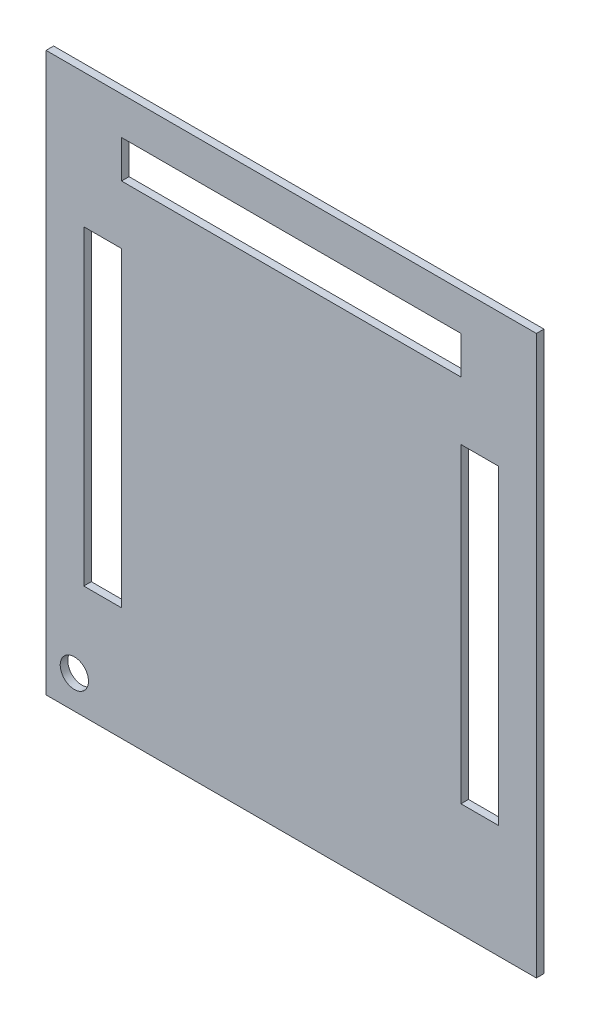
ISO-10303-21;
HEADER;
FILE_DESCRIPTION(('STEP AP214'),'2;1');
FILE_NAME('part.step','',(''),(''),'','','');
FILE_SCHEMA(('AUTOMOTIVE_DESIGN { 1 0 10303 214 1 1 1 1 }'));
ENDSEC;
DATA;
#1=APPLICATION_CONTEXT('core data for automotive mechanical design processes');
#2=APPLICATION_PROTOCOL_DEFINITION('international standard','automotive_design',2000,#1);
#3=PRODUCT_CONTEXT('',#1,'mechanical');
#4=PRODUCT('Part','Part','',(#3));
#5=PRODUCT_RELATED_PRODUCT_CATEGORY('part','',(#4));
#6=PRODUCT_DEFINITION_FORMATION('','',#4);
#7=PRODUCT_DEFINITION_CONTEXT('part definition',#1,'design');
#8=PRODUCT_DEFINITION('design','',#6,#7);
#9=PRODUCT_DEFINITION_SHAPE('','',#8);
#10=(LENGTH_UNIT() NAMED_UNIT(*) SI_UNIT(.MILLI.,.METRE.));
#11=(NAMED_UNIT(*) PLANE_ANGLE_UNIT() SI_UNIT($,.RADIAN.));
#12=(NAMED_UNIT(*) SI_UNIT($,.STERADIAN.) SOLID_ANGLE_UNIT());
#13=UNCERTAINTY_MEASURE_WITH_UNIT(LENGTH_MEASURE(1.E-05),#10,'distance_accuracy_value','');
#14=(GEOMETRIC_REPRESENTATION_CONTEXT(3) GLOBAL_UNCERTAINTY_ASSIGNED_CONTEXT((#13)) GLOBAL_UNIT_ASSIGNED_CONTEXT((#10,
#11,#12)) REPRESENTATION_CONTEXT('',''));
#15=CARTESIAN_POINT('',(0.,0.,0.));
#16=DIRECTION('',(0.,0.,1.));
#17=DIRECTION('',(1.,0.,0.));
#18=AXIS2_PLACEMENT_3D('',#15,#16,#17);
#19=CARTESIAN_POINT('',(0.,0.,4.));
#20=DIRECTION('',(1.,0.,0.));
#21=DIRECTION('',(0.,0.,-1.));
#22=AXIS2_PLACEMENT_3D('',#19,#20,#21);
#23=PLANE('',#22);
#24=DIRECTION('',(0.,-1.,0.));
#25=VECTOR('',#24,1.);
#26=CARTESIAN_POINT('',(0.,0.,0.));
#27=LINE('',#26,#25);
#28=CARTESIAN_POINT('',(0.,296.,0.));
#29=VERTEX_POINT('',#28);
#30=CARTESIAN_POINT('',(0.,0.,0.));
#31=VERTEX_POINT('',#30);
#32=EDGE_CURVE('E286',#29,#31,#27,.T.);
#33=ORIENTED_EDGE('',*,*,#32,.T.);
#34=DIRECTION('',(0.,0.,-1.));
#35=VECTOR('',#34,1.);
#36=CARTESIAN_POINT('',(0.,0.,4.));
#37=LINE('',#36,#35);
#38=CARTESIAN_POINT('',(0.,0.,4.));
#39=VERTEX_POINT('',#38);
#40=EDGE_CURVE('E11',#39,#31,#37,.T.);
#41=ORIENTED_EDGE('',*,*,#40,.F.);
#42=DIRECTION('',(0.,-1.,0.));
#43=VECTOR('',#42,1.);
#44=CARTESIAN_POINT('',(0.,0.,4.));
#45=LINE('',#44,#43);
#46=CARTESIAN_POINT('',(0.,296.,4.));
#47=VERTEX_POINT('',#46);
#48=EDGE_CURVE('E296',#47,#39,#45,.T.);
#49=ORIENTED_EDGE('',*,*,#48,.F.);
#50=DIRECTION('',(0.,0.,-1.));
#51=VECTOR('',#50,1.);
#52=CARTESIAN_POINT('',(0.,296.,4.));
#53=LINE('',#52,#51);
#54=EDGE_CURVE('E310',#47,#29,#53,.T.);
#55=ORIENTED_EDGE('',*,*,#54,.T.);
#56=EDGE_LOOP('',(#33,#41,#49,#55));
#57=FACE_BOUND('',#56,.T.);
#58=ADVANCED_FACE('F45',(#57),#23,.F.);
#59=CARTESIAN_POINT('',(0.,0.,4.));
#60=DIRECTION('',(0.,1.,0.));
#61=DIRECTION('',(0.,0.,1.));
#62=AXIS2_PLACEMENT_3D('',#59,#60,#61);
#63=PLANE('',#62);
#64=DIRECTION('',(1.,0.,0.));
#65=VECTOR('',#64,1.);
#66=CARTESIAN_POINT('',(0.,0.,0.));
#67=LINE('',#66,#65);
#68=CARTESIAN_POINT('',(260.,0.,0.));
#69=VERTEX_POINT('',#68);
#70=EDGE_CURVE('E314',#31,#69,#67,.T.);
#71=ORIENTED_EDGE('',*,*,#70,.T.);
#72=DIRECTION('',(0.,0.,-1.));
#73=VECTOR('',#72,1.);
#74=CARTESIAN_POINT('',(260.,0.,4.));
#75=LINE('',#74,#73);
#76=CARTESIAN_POINT('',(260.,0.,4.));
#77=VERTEX_POINT('',#76);
#78=EDGE_CURVE('E53',#77,#69,#75,.T.);
#79=ORIENTED_EDGE('',*,*,#78,.F.);
#80=DIRECTION('',(1.,0.,0.));
#81=VECTOR('',#80,1.);
#82=CARTESIAN_POINT('',(0.,0.,4.));
#83=LINE('',#82,#81);
#84=EDGE_CURVE('E300',#39,#77,#83,.T.);
#85=ORIENTED_EDGE('',*,*,#84,.F.);
#86=ORIENTED_EDGE('',*,*,#40,.T.);
#87=EDGE_LOOP('',(#71,#79,#85,#86));
#88=FACE_BOUND('',#87,.T.);
#89=ADVANCED_FACE('F349',(#88),#63,.F.);
#90=CARTESIAN_POINT('',(260.,0.,4.));
#91=DIRECTION('',(-1.,0.,0.));
#92=DIRECTION('',(0.,0.,1.));
#93=AXIS2_PLACEMENT_3D('',#90,#91,#92);
#94=PLANE('',#93);
#95=DIRECTION('',(0.,1.,0.));
#96=VECTOR('',#95,1.);
#97=CARTESIAN_POINT('',(260.,0.,0.));
#98=LINE('',#97,#96);
#99=CARTESIAN_POINT('',(260.,296.,0.));
#100=VERTEX_POINT('',#99);
#101=EDGE_CURVE('E317',#69,#100,#98,.T.);
#102=ORIENTED_EDGE('',*,*,#101,.T.);
#103=DIRECTION('',(0.,0.,-1.));
#104=VECTOR('',#103,1.);
#105=CARTESIAN_POINT('',(260.,296.,4.));
#106=LINE('',#105,#104);
#107=CARTESIAN_POINT('',(260.,296.,4.));
#108=VERTEX_POINT('',#107);
#109=EDGE_CURVE('E325',#108,#100,#106,.T.);
#110=ORIENTED_EDGE('',*,*,#109,.F.);
#111=DIRECTION('',(0.,1.,0.));
#112=VECTOR('',#111,1.);
#113=CARTESIAN_POINT('',(260.,0.,4.));
#114=LINE('',#113,#112);
#115=EDGE_CURVE('E304',#77,#108,#114,.T.);
#116=ORIENTED_EDGE('',*,*,#115,.F.);
#117=ORIENTED_EDGE('',*,*,#78,.T.);
#118=EDGE_LOOP('',(#102,#110,#116,#117));
#119=FACE_BOUND('',#118,.T.);
#120=ADVANCED_FACE('F334',(#119),#94,.F.);
#121=CARTESIAN_POINT('',(0.,296.,4.));
#122=DIRECTION('',(0.,-1.,0.));
#123=DIRECTION('',(0.,0.,-1.));
#124=AXIS2_PLACEMENT_3D('',#121,#122,#123);
#125=PLANE('',#124);
#126=DIRECTION('',(-1.,0.,0.));
#127=VECTOR('',#126,1.);
#128=CARTESIAN_POINT('',(0.,296.,0.));
#129=LINE('',#128,#127);
#130=EDGE_CURVE('E301',#100,#29,#129,.T.);
#131=ORIENTED_EDGE('',*,*,#130,.T.);
#132=ORIENTED_EDGE('',*,*,#54,.F.);
#133=DIRECTION('',(-1.,0.,0.));
#134=VECTOR('',#133,1.);
#135=CARTESIAN_POINT('',(0.,296.,4.));
#136=LINE('',#135,#134);
#137=EDGE_CURVE('E307',#108,#47,#136,.T.);
#138=ORIENTED_EDGE('',*,*,#137,.F.);
#139=ORIENTED_EDGE('',*,*,#109,.T.);
#140=EDGE_LOOP('',(#131,#132,#138,#139));
#141=FACE_BOUND('',#140,.T.);
#142=ADVANCED_FACE('F343',(#141),#125,.F.);
#143=CARTESIAN_POINT('',(0.,0.,4.));
#144=DIRECTION('',(0.,0.,-1.));
#145=DIRECTION('',(-1.,0.,0.));
#146=AXIS2_PLACEMENT_3D('',#143,#144,#145);
#147=PLANE('',#146);
#148=CARTESIAN_POINT('',(15.,17.5,4.));
#149=DIRECTION('',(0.,0.,1.));
#150=DIRECTION('',(1.,0.,0.));
#151=AXIS2_PLACEMENT_3D('',#148,#149,#150);
#152=CIRCLE('',#151,7.5);
#153=CARTESIAN_POINT('',(22.5,17.5,4.));
#154=VERTEX_POINT('',#153);
#155=EDGE_CURVE('E218',#154,#154,#152,.T.);
#156=ORIENTED_EDGE('',*,*,#155,.F.);
#157=EDGE_LOOP('',(#156));
#158=FACE_BOUND('',#157,.T.);
#159=DIRECTION('',(-1.,0.,0.));
#160=VECTOR('',#159,1.);
#161=CARTESIAN_POINT('',(220.,276.,4.));
#162=LINE('',#161,#160);
#163=CARTESIAN_POINT('',(220.,276.,4.));
#164=VERTEX_POINT('',#163);
#165=CARTESIAN_POINT('',(40.,276.,4.));
#166=VERTEX_POINT('',#165);
#167=EDGE_CURVE('E228',#164,#166,#162,.T.);
#168=ORIENTED_EDGE('',*,*,#167,.F.);
#169=DIRECTION('',(0.,1.,0.));
#170=VECTOR('',#169,1.);
#171=CARTESIAN_POINT('',(220.,276.,4.));
#172=LINE('',#171,#170);
#173=CARTESIAN_POINT('',(220.,256.,4.));
#174=VERTEX_POINT('',#173);
#175=EDGE_CURVE('E60',#174,#164,#172,.T.);
#176=ORIENTED_EDGE('',*,*,#175,.F.);
#177=DIRECTION('',(1.,0.,0.));
#178=VECTOR('',#177,1.);
#179=CARTESIAN_POINT('',(220.,256.,4.));
#180=LINE('',#179,#178);
#181=CARTESIAN_POINT('',(40.,256.,4.));
#182=VERTEX_POINT('',#181);
#183=EDGE_CURVE('E219',#182,#174,#180,.T.);
#184=ORIENTED_EDGE('',*,*,#183,.F.);
#185=DIRECTION('',(0.,-1.,0.));
#186=VECTOR('',#185,1.);
#187=CARTESIAN_POINT('',(40.,276.,4.));
#188=LINE('',#187,#186);
#189=EDGE_CURVE('E223',#166,#182,#188,.T.);
#190=ORIENTED_EDGE('',*,*,#189,.F.);
#191=EDGE_LOOP('',(#168,#176,#184,#190));
#192=FACE_BOUND('',#191,.T.);
#193=DIRECTION('',(1.,0.,0.));
#194=VECTOR('',#193,1.);
#195=CARTESIAN_POINT('',(20.,60.,4.));
#196=LINE('',#195,#194);
#197=CARTESIAN_POINT('',(20.,60.,4.));
#198=VERTEX_POINT('',#197);
#199=CARTESIAN_POINT('',(40.,60.,4.));
#200=VERTEX_POINT('',#199);
#201=EDGE_CURVE('E180',#198,#200,#196,.T.);
#202=ORIENTED_EDGE('',*,*,#201,.F.);
#203=DIRECTION('',(0.,-1.,0.));
#204=VECTOR('',#203,1.);
#205=CARTESIAN_POINT('',(20.,60.,4.));
#206=LINE('',#205,#204);
#207=CARTESIAN_POINT('',(20.,225.,4.));
#208=VERTEX_POINT('',#207);
#209=EDGE_CURVE('E68',#208,#198,#206,.T.);
#210=ORIENTED_EDGE('',*,*,#209,.F.);
#211=DIRECTION('',(-1.,0.,0.));
#212=VECTOR('',#211,1.);
#213=CARTESIAN_POINT('',(20.,225.,4.));
#214=LINE('',#213,#212);
#215=CARTESIAN_POINT('',(40.,225.,4.));
#216=VERTEX_POINT('',#215);
#217=EDGE_CURVE('E168',#216,#208,#214,.T.);
#218=ORIENTED_EDGE('',*,*,#217,.F.);
#219=DIRECTION('',(0.,1.,0.));
#220=VECTOR('',#219,1.);
#221=CARTESIAN_POINT('',(40.,60.,4.));
#222=LINE('',#221,#220);
#223=EDGE_CURVE('E174',#200,#216,#222,.T.);
#224=ORIENTED_EDGE('',*,*,#223,.F.);
#225=EDGE_LOOP('',(#202,#210,#218,#224));
#226=FACE_BOUND('',#225,.T.);
#227=DIRECTION('',(-1.,0.,0.));
#228=VECTOR('',#227,1.);
#229=CARTESIAN_POINT('',(240.,225.,4.));
#230=LINE('',#229,#228);
#231=CARTESIAN_POINT('',(240.,225.,4.));
#232=VERTEX_POINT('',#231);
#233=CARTESIAN_POINT('',(220.,225.,4.));
#234=VERTEX_POINT('',#233);
#235=EDGE_CURVE('E186',#232,#234,#230,.T.);
#236=ORIENTED_EDGE('',*,*,#235,.F.);
#237=DIRECTION('',(0.,1.,0.));
#238=VECTOR('',#237,1.);
#239=CARTESIAN_POINT('',(240.,60.,4.));
#240=LINE('',#239,#238);
#241=CARTESIAN_POINT('',(240.,60.,4.));
#242=VERTEX_POINT('',#241);
#243=EDGE_CURVE('E182',#242,#232,#240,.T.);
#244=ORIENTED_EDGE('',*,*,#243,.F.);
#245=DIRECTION('',(1.,0.,0.));
#246=VECTOR('',#245,1.);
#247=CARTESIAN_POINT('',(240.,60.,4.));
#248=LINE('',#247,#246);
#249=CARTESIAN_POINT('',(220.,60.,4.));
#250=VERTEX_POINT('',#249);
#251=EDGE_CURVE('E260',#250,#242,#248,.T.);
#252=ORIENTED_EDGE('',*,*,#251,.F.);
#253=DIRECTION('',(0.,-1.,0.));
#254=VECTOR('',#253,1.);
#255=CARTESIAN_POINT('',(220.,60.,4.));
#256=LINE('',#255,#254);
#257=EDGE_CURVE('E276',#234,#250,#256,.T.);
#258=ORIENTED_EDGE('',*,*,#257,.F.);
#259=EDGE_LOOP('',(#236,#244,#252,#258));
#260=FACE_BOUND('',#259,.T.);
#261=ORIENTED_EDGE('',*,*,#48,.T.);
#262=ORIENTED_EDGE('',*,*,#84,.T.);
#263=ORIENTED_EDGE('',*,*,#115,.T.);
#264=ORIENTED_EDGE('',*,*,#137,.T.);
#265=EDGE_LOOP('',(#261,#262,#263,#264));
#266=FACE_BOUND('',#265,.T.);
#267=ADVANCED_FACE('F177',(#158,#192,#226,#260,#266),#147,.F.);
#268=CARTESIAN_POINT('',(0.,0.,0.));
#269=DIRECTION('',(0.,0.,-1.));
#270=DIRECTION('',(-1.,0.,0.));
#271=AXIS2_PLACEMENT_3D('',#268,#269,#270);
#272=PLANE('',#271);
#273=CARTESIAN_POINT('',(15.,17.5,0.));
#274=DIRECTION('',(0.,0.,1.));
#275=DIRECTION('',(1.,0.,0.));
#276=AXIS2_PLACEMENT_3D('',#273,#274,#275);
#277=CIRCLE('',#276,7.5);
#278=CARTESIAN_POINT('',(22.5,17.5,0.));
#279=VERTEX_POINT('',#278);
#280=EDGE_CURVE('E251',#279,#279,#277,.T.);
#281=ORIENTED_EDGE('',*,*,#280,.T.);
#282=EDGE_LOOP('',(#281));
#283=FACE_BOUND('',#282,.T.);
#284=DIRECTION('',(0.,1.,0.));
#285=VECTOR('',#284,1.);
#286=CARTESIAN_POINT('',(220.,276.,0.));
#287=LINE('',#286,#285);
#288=CARTESIAN_POINT('',(220.,256.,0.));
#289=VERTEX_POINT('',#288);
#290=CARTESIAN_POINT('',(220.,276.,0.));
#291=VERTEX_POINT('',#290);
#292=EDGE_CURVE('E224',#289,#291,#287,.T.);
#293=ORIENTED_EDGE('',*,*,#292,.T.);
#294=DIRECTION('',(-1.,0.,0.));
#295=VECTOR('',#294,1.);
#296=CARTESIAN_POINT('',(220.,276.,0.));
#297=LINE('',#296,#295);
#298=CARTESIAN_POINT('',(40.,276.,0.));
#299=VERTEX_POINT('',#298);
#300=EDGE_CURVE('E241',#291,#299,#297,.T.);
#301=ORIENTED_EDGE('',*,*,#300,.T.);
#302=DIRECTION('',(0.,-1.,0.));
#303=VECTOR('',#302,1.);
#304=CARTESIAN_POINT('',(40.,276.,0.));
#305=LINE('',#304,#303);
#306=CARTESIAN_POINT('',(40.,256.,0.));
#307=VERTEX_POINT('',#306);
#308=EDGE_CURVE('E237',#299,#307,#305,.T.);
#309=ORIENTED_EDGE('',*,*,#308,.T.);
#310=DIRECTION('',(1.,0.,0.));
#311=VECTOR('',#310,1.);
#312=CARTESIAN_POINT('',(220.,256.,0.));
#313=LINE('',#312,#311);
#314=EDGE_CURVE('E208',#307,#289,#313,.T.);
#315=ORIENTED_EDGE('',*,*,#314,.T.);
#316=EDGE_LOOP('',(#293,#301,#309,#315));
#317=FACE_BOUND('',#316,.T.);
#318=DIRECTION('',(0.,-1.,0.));
#319=VECTOR('',#318,1.);
#320=CARTESIAN_POINT('',(20.,60.,0.));
#321=LINE('',#320,#319);
#322=CARTESIAN_POINT('',(20.,225.,0.));
#323=VERTEX_POINT('',#322);
#324=CARTESIAN_POINT('',(20.,60.,0.));
#325=VERTEX_POINT('',#324);
#326=EDGE_CURVE('E160',#323,#325,#321,.T.);
#327=ORIENTED_EDGE('',*,*,#326,.T.);
#328=DIRECTION('',(1.,0.,0.));
#329=VECTOR('',#328,1.);
#330=CARTESIAN_POINT('',(20.,60.,0.));
#331=LINE('',#330,#329);
#332=CARTESIAN_POINT('',(40.,60.,0.));
#333=VERTEX_POINT('',#332);
#334=EDGE_CURVE('E199',#325,#333,#331,.T.);
#335=ORIENTED_EDGE('',*,*,#334,.T.);
#336=DIRECTION('',(0.,1.,0.));
#337=VECTOR('',#336,1.);
#338=CARTESIAN_POINT('',(40.,60.,0.));
#339=LINE('',#338,#337);
#340=CARTESIAN_POINT('',(40.,225.,0.));
#341=VERTEX_POINT('',#340);
#342=EDGE_CURVE('E194',#333,#341,#339,.T.);
#343=ORIENTED_EDGE('',*,*,#342,.T.);
#344=DIRECTION('',(-1.,0.,0.));
#345=VECTOR('',#344,1.);
#346=CARTESIAN_POINT('',(20.,225.,0.));
#347=LINE('',#346,#345);
#348=EDGE_CURVE('E191',#341,#323,#347,.T.);
#349=ORIENTED_EDGE('',*,*,#348,.T.);
#350=EDGE_LOOP('',(#327,#335,#343,#349));
#351=FACE_BOUND('',#350,.T.);
#352=DIRECTION('',(0.,1.,0.));
#353=VECTOR('',#352,1.);
#354=CARTESIAN_POINT('',(240.,60.,0.));
#355=LINE('',#354,#353);
#356=CARTESIAN_POINT('',(240.,60.,0.));
#357=VERTEX_POINT('',#356);
#358=CARTESIAN_POINT('',(240.,225.,0.));
#359=VERTEX_POINT('',#358);
#360=EDGE_CURVE('E255',#357,#359,#355,.T.);
#361=ORIENTED_EDGE('',*,*,#360,.T.);
#362=DIRECTION('',(-1.,0.,0.));
#363=VECTOR('',#362,1.);
#364=CARTESIAN_POINT('',(240.,225.,0.));
#365=LINE('',#364,#363);
#366=CARTESIAN_POINT('',(220.,225.,0.));
#367=VERTEX_POINT('',#366);
#368=EDGE_CURVE('E259',#359,#367,#365,.T.);
#369=ORIENTED_EDGE('',*,*,#368,.T.);
#370=DIRECTION('',(0.,-1.,0.));
#371=VECTOR('',#370,1.);
#372=CARTESIAN_POINT('',(220.,60.,0.));
#373=LINE('',#372,#371);
#374=CARTESIAN_POINT('',(220.,60.,0.));
#375=VERTEX_POINT('',#374);
#376=EDGE_CURVE('E264',#367,#375,#373,.T.);
#377=ORIENTED_EDGE('',*,*,#376,.T.);
#378=DIRECTION('',(1.,0.,0.));
#379=VECTOR('',#378,1.);
#380=CARTESIAN_POINT('',(240.,60.,0.));
#381=LINE('',#380,#379);
#382=EDGE_CURVE('E268',#375,#357,#381,.T.);
#383=ORIENTED_EDGE('',*,*,#382,.T.);
#384=EDGE_LOOP('',(#361,#369,#377,#383));
#385=FACE_BOUND('',#384,.T.);
#386=ORIENTED_EDGE('',*,*,#32,.F.);
#387=ORIENTED_EDGE('',*,*,#130,.F.);
#388=ORIENTED_EDGE('',*,*,#101,.F.);
#389=ORIENTED_EDGE('',*,*,#70,.F.);
#390=EDGE_LOOP('',(#386,#387,#388,#389));
#391=FACE_BOUND('',#390,.T.);
#392=ADVANCED_FACE('F340',(#283,#317,#351,#385,#391),#272,.T.);
#393=CARTESIAN_POINT('',(240.,60.,0.));
#394=DIRECTION('',(1.,0.,0.));
#395=DIRECTION('',(0.,0.,-1.));
#396=AXIS2_PLACEMENT_3D('',#393,#394,#395);
#397=PLANE('',#396);
#398=ORIENTED_EDGE('',*,*,#243,.T.);
#399=DIRECTION('',(0.,0.,1.));
#400=VECTOR('',#399,1.);
#401=CARTESIAN_POINT('',(240.,225.,0.));
#402=LINE('',#401,#400);
#403=EDGE_CURVE('E271',#359,#232,#402,.T.);
#404=ORIENTED_EDGE('',*,*,#403,.F.);
#405=ORIENTED_EDGE('',*,*,#360,.F.);
#406=DIRECTION('',(0.,0.,1.));
#407=VECTOR('',#406,1.);
#408=CARTESIAN_POINT('',(240.,60.,0.));
#409=LINE('',#408,#407);
#410=EDGE_CURVE('E283',#357,#242,#409,.T.);
#411=ORIENTED_EDGE('',*,*,#410,.T.);
#412=EDGE_LOOP('',(#398,#404,#405,#411));
#413=FACE_BOUND('',#412,.T.);
#414=ADVANCED_FACE('F361',(#413),#397,.F.);
#415=CARTESIAN_POINT('',(240.,60.,0.));
#416=DIRECTION('',(0.,-1.,0.));
#417=DIRECTION('',(0.,0.,-1.));
#418=AXIS2_PLACEMENT_3D('',#415,#416,#417);
#419=PLANE('',#418);
#420=ORIENTED_EDGE('',*,*,#251,.T.);
#421=ORIENTED_EDGE('',*,*,#410,.F.);
#422=ORIENTED_EDGE('',*,*,#382,.F.);
#423=DIRECTION('',(0.,0.,1.));
#424=VECTOR('',#423,1.);
#425=CARTESIAN_POINT('',(220.,60.,0.));
#426=LINE('',#425,#424);
#427=EDGE_CURVE('E287',#375,#250,#426,.T.);
#428=ORIENTED_EDGE('',*,*,#427,.T.);
#429=EDGE_LOOP('',(#420,#421,#422,#428));
#430=FACE_BOUND('',#429,.T.);
#431=ADVANCED_FACE('F368',(#430),#419,.F.);
#432=CARTESIAN_POINT('',(220.,60.,0.));
#433=DIRECTION('',(-1.,0.,0.));
#434=DIRECTION('',(0.,0.,1.));
#435=AXIS2_PLACEMENT_3D('',#432,#433,#434);
#436=PLANE('',#435);
#437=ORIENTED_EDGE('',*,*,#257,.T.);
#438=ORIENTED_EDGE('',*,*,#427,.F.);
#439=ORIENTED_EDGE('',*,*,#376,.F.);
#440=DIRECTION('',(0.,0.,1.));
#441=VECTOR('',#440,1.);
#442=CARTESIAN_POINT('',(220.,225.,0.));
#443=LINE('',#442,#441);
#444=EDGE_CURVE('E290',#367,#234,#443,.T.);
#445=ORIENTED_EDGE('',*,*,#444,.T.);
#446=EDGE_LOOP('',(#437,#438,#439,#445));
#447=FACE_BOUND('',#446,.T.);
#448=ADVANCED_FACE('F373',(#447),#436,.F.);
#449=CARTESIAN_POINT('',(240.,225.,0.));
#450=DIRECTION('',(0.,1.,0.));
#451=DIRECTION('',(0.,0.,1.));
#452=AXIS2_PLACEMENT_3D('',#449,#450,#451);
#453=PLANE('',#452);
#454=ORIENTED_EDGE('',*,*,#235,.T.);
#455=ORIENTED_EDGE('',*,*,#444,.F.);
#456=ORIENTED_EDGE('',*,*,#368,.F.);
#457=ORIENTED_EDGE('',*,*,#403,.T.);
#458=EDGE_LOOP('',(#454,#455,#456,#457));
#459=FACE_BOUND('',#458,.T.);
#460=ADVANCED_FACE('F370',(#459),#453,.F.);
#461=CARTESIAN_POINT('',(20.,60.,0.));
#462=DIRECTION('',(-1.,0.,0.));
#463=DIRECTION('',(0.,0.,1.));
#464=AXIS2_PLACEMENT_3D('',#461,#462,#463);
#465=PLANE('',#464);
#466=ORIENTED_EDGE('',*,*,#209,.T.);
#467=DIRECTION('',(0.,0.,1.));
#468=VECTOR('',#467,1.);
#469=CARTESIAN_POINT('',(20.,60.,0.));
#470=LINE('',#469,#468);
#471=EDGE_CURVE('E195',#325,#198,#470,.T.);
#472=ORIENTED_EDGE('',*,*,#471,.F.);
#473=ORIENTED_EDGE('',*,*,#326,.F.);
#474=DIRECTION('',(0.,0.,1.));
#475=VECTOR('',#474,1.);
#476=CARTESIAN_POINT('',(20.,225.,0.));
#477=LINE('',#476,#475);
#478=EDGE_CURVE('E156',#323,#208,#477,.T.);
#479=ORIENTED_EDGE('',*,*,#478,.T.);
#480=EDGE_LOOP('',(#466,#472,#473,#479));
#481=FACE_BOUND('',#480,.T.);
#482=ADVANCED_FACE('F158',(#481),#465,.F.);
#483=CARTESIAN_POINT('',(20.,225.,0.));
#484=DIRECTION('',(0.,1.,0.));
#485=DIRECTION('',(0.,0.,1.));
#486=AXIS2_PLACEMENT_3D('',#483,#484,#485);
#487=PLANE('',#486);
#488=ORIENTED_EDGE('',*,*,#217,.T.);
#489=ORIENTED_EDGE('',*,*,#478,.F.);
#490=ORIENTED_EDGE('',*,*,#348,.F.);
#491=DIRECTION('',(0.,0.,1.));
#492=VECTOR('',#491,1.);
#493=CARTESIAN_POINT('',(40.,225.,0.));
#494=LINE('',#493,#492);
#495=EDGE_CURVE('E165',#341,#216,#494,.T.);
#496=ORIENTED_EDGE('',*,*,#495,.T.);
#497=EDGE_LOOP('',(#488,#489,#490,#496));
#498=FACE_BOUND('',#497,.T.);
#499=ADVANCED_FACE('F169',(#498),#487,.F.);
#500=CARTESIAN_POINT('',(40.,60.,0.));
#501=DIRECTION('',(1.,0.,0.));
#502=DIRECTION('',(0.,0.,-1.));
#503=AXIS2_PLACEMENT_3D('',#500,#501,#502);
#504=PLANE('',#503);
#505=ORIENTED_EDGE('',*,*,#223,.T.);
#506=ORIENTED_EDGE('',*,*,#495,.F.);
#507=ORIENTED_EDGE('',*,*,#342,.F.);
#508=DIRECTION('',(0.,0.,1.));
#509=VECTOR('',#508,1.);
#510=CARTESIAN_POINT('',(40.,60.,0.));
#511=LINE('',#510,#509);
#512=EDGE_CURVE('E525',#333,#200,#511,.T.);
#513=ORIENTED_EDGE('',*,*,#512,.T.);
#514=EDGE_LOOP('',(#505,#506,#507,#513));
#515=FACE_BOUND('',#514,.T.);
#516=ADVANCED_FACE('F403',(#515),#504,.F.);
#517=CARTESIAN_POINT('',(20.,60.,0.));
#518=DIRECTION('',(0.,-1.,0.));
#519=DIRECTION('',(0.,0.,-1.));
#520=AXIS2_PLACEMENT_3D('',#517,#518,#519);
#521=PLANE('',#520);
#522=ORIENTED_EDGE('',*,*,#201,.T.);
#523=ORIENTED_EDGE('',*,*,#512,.F.);
#524=ORIENTED_EDGE('',*,*,#334,.F.);
#525=ORIENTED_EDGE('',*,*,#471,.T.);
#526=EDGE_LOOP('',(#522,#523,#524,#525));
#527=FACE_BOUND('',#526,.T.);
#528=ADVANCED_FACE('F400',(#527),#521,.F.);
#529=CARTESIAN_POINT('',(220.,276.,0.));
#530=DIRECTION('',(1.,0.,0.));
#531=DIRECTION('',(0.,0.,-1.));
#532=AXIS2_PLACEMENT_3D('',#529,#530,#531);
#533=PLANE('',#532);
#534=ORIENTED_EDGE('',*,*,#175,.T.);
#535=DIRECTION('',(0.,0.,1.));
#536=VECTOR('',#535,1.);
#537=CARTESIAN_POINT('',(220.,276.,0.));
#538=LINE('',#537,#536);
#539=EDGE_CURVE('E205',#291,#164,#538,.T.);
#540=ORIENTED_EDGE('',*,*,#539,.F.);
#541=ORIENTED_EDGE('',*,*,#292,.F.);
#542=DIRECTION('',(0.,0.,1.));
#543=VECTOR('',#542,1.);
#544=CARTESIAN_POINT('',(220.,256.,0.));
#545=LINE('',#544,#543);
#546=EDGE_CURVE('E215',#289,#174,#545,.T.);
#547=ORIENTED_EDGE('',*,*,#546,.T.);
#548=EDGE_LOOP('',(#534,#540,#541,#547));
#549=FACE_BOUND('',#548,.T.);
#550=ADVANCED_FACE('F390',(#549),#533,.F.);
#551=CARTESIAN_POINT('',(220.,256.,0.));
#552=DIRECTION('',(0.,-1.,0.));
#553=DIRECTION('',(1.,0.,0.));
#554=AXIS2_PLACEMENT_3D('',#551,#552,#553);
#555=PLANE('',#554);
#556=ORIENTED_EDGE('',*,*,#183,.T.);
#557=ORIENTED_EDGE('',*,*,#546,.F.);
#558=ORIENTED_EDGE('',*,*,#314,.F.);
#559=DIRECTION('',(0.,0.,1.));
#560=VECTOR('',#559,1.);
#561=CARTESIAN_POINT('',(40.,256.,0.));
#562=LINE('',#561,#560);
#563=EDGE_CURVE('E212',#307,#182,#562,.T.);
#564=ORIENTED_EDGE('',*,*,#563,.T.);
#565=EDGE_LOOP('',(#556,#557,#558,#564));
#566=FACE_BOUND('',#565,.T.);
#567=ADVANCED_FACE('F386',(#566),#555,.F.);
#568=CARTESIAN_POINT('',(40.,276.,0.));
#569=DIRECTION('',(-1.,0.,0.));
#570=DIRECTION('',(0.,0.,1.));
#571=AXIS2_PLACEMENT_3D('',#568,#569,#570);
#572=PLANE('',#571);
#573=ORIENTED_EDGE('',*,*,#189,.T.);
#574=ORIENTED_EDGE('',*,*,#563,.F.);
#575=ORIENTED_EDGE('',*,*,#308,.F.);
#576=DIRECTION('',(0.,0.,1.));
#577=VECTOR('',#576,1.);
#578=CARTESIAN_POINT('',(40.,276.,0.));
#579=LINE('',#578,#577);
#580=EDGE_CURVE('E209',#299,#166,#579,.T.);
#581=ORIENTED_EDGE('',*,*,#580,.T.);
#582=EDGE_LOOP('',(#573,#574,#575,#581));
#583=FACE_BOUND('',#582,.T.);
#584=ADVANCED_FACE('F389',(#583),#572,.F.);
#585=CARTESIAN_POINT('',(220.,276.,0.));
#586=DIRECTION('',(0.,1.,0.));
#587=DIRECTION('',(-1.,0.,0.));
#588=AXIS2_PLACEMENT_3D('',#585,#586,#587);
#589=PLANE('',#588);
#590=ORIENTED_EDGE('',*,*,#167,.T.);
#591=ORIENTED_EDGE('',*,*,#580,.F.);
#592=ORIENTED_EDGE('',*,*,#300,.F.);
#593=ORIENTED_EDGE('',*,*,#539,.T.);
#594=EDGE_LOOP('',(#590,#591,#592,#593));
#595=FACE_BOUND('',#594,.T.);
#596=ADVANCED_FACE('F384',(#595),#589,.F.);
#597=CARTESIAN_POINT('',(15.,17.5,0.));
#598=DIRECTION('',(0.,0.,1.));
#599=DIRECTION('',(1.,0.,0.));
#600=AXIS2_PLACEMENT_3D('',#597,#598,#599);
#601=CYLINDRICAL_SURFACE('',#600,7.5);
#602=ORIENTED_EDGE('',*,*,#280,.F.);
#603=EDGE_LOOP('',(#602));
#604=FACE_BOUND('',#603,.T.);
#605=ORIENTED_EDGE('',*,*,#155,.T.);
#606=EDGE_LOOP('',(#605));
#607=FACE_BOUND('',#606,.T.);
#608=ADVANCED_FACE('F381',(#604,#607),#601,.F.);
#609=CLOSED_SHELL('',(#58,#89,#120,#142,#267,#392,#414,#431,#448,#460,#482,#499,#516,#528,#550,
#567,#584,#596,#608));
#610=MANIFOLD_SOLID_BREP('B2',#609);
#611=ADVANCED_BREP_SHAPE_REPRESENTATION('',(#18,#610),#14);
#612=SHAPE_DEFINITION_REPRESENTATION(#9,#611);
ENDSEC;
END-ISO-10303-21;
